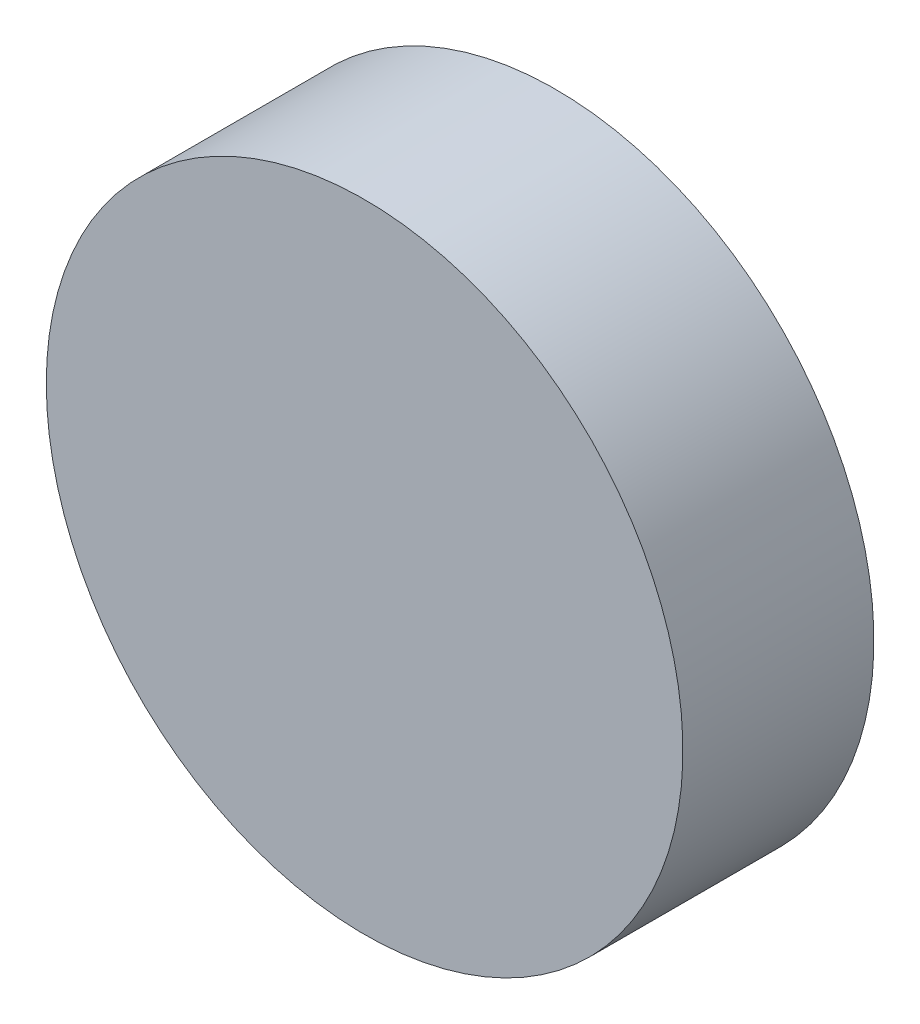
ISO-10303-21;
HEADER;
FILE_DESCRIPTION(('STEP AP214'),'2;1');
FILE_NAME('part.step','',(''),(''),'','','');
FILE_SCHEMA(('AUTOMOTIVE_DESIGN { 1 0 10303 214 1 1 1 1 }'));
ENDSEC;
DATA;
#1=APPLICATION_CONTEXT('core data for automotive mechanical design processes');
#2=APPLICATION_PROTOCOL_DEFINITION('international standard','automotive_design',2000,#1);
#3=PRODUCT_CONTEXT('',#1,'mechanical');
#4=PRODUCT('Part','Part','',(#3));
#5=PRODUCT_RELATED_PRODUCT_CATEGORY('part','',(#4));
#6=PRODUCT_DEFINITION_FORMATION('','',#4);
#7=PRODUCT_DEFINITION_CONTEXT('part definition',#1,'design');
#8=PRODUCT_DEFINITION('design','',#6,#7);
#9=PRODUCT_DEFINITION_SHAPE('','',#8);
#10=(LENGTH_UNIT() NAMED_UNIT(*) SI_UNIT(.MILLI.,.METRE.));
#11=(NAMED_UNIT(*) PLANE_ANGLE_UNIT() SI_UNIT($,.RADIAN.));
#12=(NAMED_UNIT(*) SI_UNIT($,.STERADIAN.) SOLID_ANGLE_UNIT());
#13=UNCERTAINTY_MEASURE_WITH_UNIT(LENGTH_MEASURE(1.E-05),#10,'distance_accuracy_value','');
#14=(GEOMETRIC_REPRESENTATION_CONTEXT(3) GLOBAL_UNCERTAINTY_ASSIGNED_CONTEXT((#13)) GLOBAL_UNIT_ASSIGNED_CONTEXT((#10,
#11,#12)) REPRESENTATION_CONTEXT('',''));
#15=CARTESIAN_POINT('',(0.,0.,0.));
#16=DIRECTION('',(0.,0.,1.));
#17=DIRECTION('',(1.,0.,0.));
#18=AXIS2_PLACEMENT_3D('',#15,#16,#17);
#19=CARTESIAN_POINT('',(0.,0.,15.));
#20=DIRECTION('',(0.,0.,1.));
#21=DIRECTION('',(1.,0.,0.));
#22=AXIS2_PLACEMENT_3D('',#19,#20,#21);
#23=PLANE('',#22);
#24=CARTESIAN_POINT('',(0.,0.,15.));
#25=DIRECTION('',(0.,0.,-1.));
#26=DIRECTION('',(-1.,0.,0.));
#27=AXIS2_PLACEMENT_3D('',#24,#25,#26);
#28=CIRCLE('',#27,25.);
#29=CARTESIAN_POINT('',(-25.,0.,15.));
#30=VERTEX_POINT('',#29);
#31=EDGE_CURVE('E56',#30,#30,#28,.T.);
#32=ORIENTED_EDGE('',*,*,#31,.F.);
#33=EDGE_LOOP('',(#32));
#34=FACE_BOUND('',#33,.T.);
#35=ADVANCED_FACE('F39',(#34),#23,.T.);
#36=CARTESIAN_POINT('',(0.,0.,10.));
#37=DIRECTION('',(0.,0.,1.));
#38=DIRECTION('',(1.,0.,0.));
#39=AXIS2_PLACEMENT_3D('',#36,#37,#38);
#40=PLANE('',#39);
#41=CARTESIAN_POINT('',(0.,0.,10.));
#42=DIRECTION('',(0.,0.,-1.));
#43=DIRECTION('',(-1.,0.,0.));
#44=AXIS2_PLACEMENT_3D('',#41,#42,#43);
#45=CIRCLE('',#44,15.);
#46=CARTESIAN_POINT('',(-15.,0.,10.));
#47=VERTEX_POINT('',#46);
#48=EDGE_CURVE('E10',#47,#47,#45,.T.);
#49=ORIENTED_EDGE('',*,*,#48,.T.);
#50=EDGE_LOOP('',(#49));
#51=FACE_BOUND('',#50,.T.);
#52=ADVANCED_FACE('F67',(#51),#40,.F.);
#53=CARTESIAN_POINT('',(0.,0.,0.));
#54=DIRECTION('',(0.,0.,-1.));
#55=DIRECTION('',(-1.,0.,0.));
#56=AXIS2_PLACEMENT_3D('',#53,#54,#55);
#57=CYLINDRICAL_SURFACE('',#56,15.);
#58=ORIENTED_EDGE('',*,*,#48,.F.);
#59=EDGE_LOOP('',(#58));
#60=FACE_BOUND('',#59,.T.);
#61=CARTESIAN_POINT('',(0.,0.,0.));
#62=DIRECTION('',(0.,0.,-1.));
#63=DIRECTION('',(-1.,0.,0.));
#64=AXIS2_PLACEMENT_3D('',#61,#62,#63);
#65=CIRCLE('',#64,15.);
#66=CARTESIAN_POINT('',(-15.,0.,0.));
#67=VERTEX_POINT('',#66);
#68=EDGE_CURVE('E46',#67,#67,#65,.T.);
#69=ORIENTED_EDGE('',*,*,#68,.T.);
#70=EDGE_LOOP('',(#69));
#71=FACE_BOUND('',#70,.T.);
#72=ADVANCED_FACE('F71',(#60,#71),#57,.F.);
#73=CARTESIAN_POINT('',(0.,0.,0.));
#74=DIRECTION('',(0.,0.,1.));
#75=DIRECTION('',(1.,0.,0.));
#76=AXIS2_PLACEMENT_3D('',#73,#74,#75);
#77=PLANE('',#76);
#78=ORIENTED_EDGE('',*,*,#68,.F.);
#79=EDGE_LOOP('',(#78));
#80=FACE_BOUND('',#79,.T.);
#81=CARTESIAN_POINT('',(0.,0.,0.));
#82=DIRECTION('',(0.,0.,-1.));
#83=DIRECTION('',(-1.,0.,0.));
#84=AXIS2_PLACEMENT_3D('',#81,#82,#83);
#85=CIRCLE('',#84,25.);
#86=CARTESIAN_POINT('',(-25.,0.,0.));
#87=VERTEX_POINT('',#86);
#88=EDGE_CURVE('E51',#87,#87,#85,.T.);
#89=ORIENTED_EDGE('',*,*,#88,.T.);
#90=EDGE_LOOP('',(#89));
#91=FACE_BOUND('',#90,.T.);
#92=ADVANCED_FACE('F75',(#80,#91),#77,.F.);
#93=CARTESIAN_POINT('',(0.,0.,0.));
#94=DIRECTION('',(0.,0.,-1.));
#95=DIRECTION('',(-1.,0.,0.));
#96=AXIS2_PLACEMENT_3D('',#93,#94,#95);
#97=CYLINDRICAL_SURFACE('',#96,25.);
#98=ORIENTED_EDGE('',*,*,#31,.T.);
#99=EDGE_LOOP('',(#98));
#100=FACE_BOUND('',#99,.T.);
#101=ORIENTED_EDGE('',*,*,#88,.F.);
#102=EDGE_LOOP('',(#101));
#103=FACE_BOUND('',#102,.T.);
#104=ADVANCED_FACE('F63',(#100,#103),#97,.T.);
#105=CLOSED_SHELL('',(#35,#52,#72,#92,#104));
#106=MANIFOLD_SOLID_BREP('B2',#105);
#107=ADVANCED_BREP_SHAPE_REPRESENTATION('',(#18,#106),#14);
#108=SHAPE_DEFINITION_REPRESENTATION(#9,#107);
ENDSEC;
END-ISO-10303-21;
